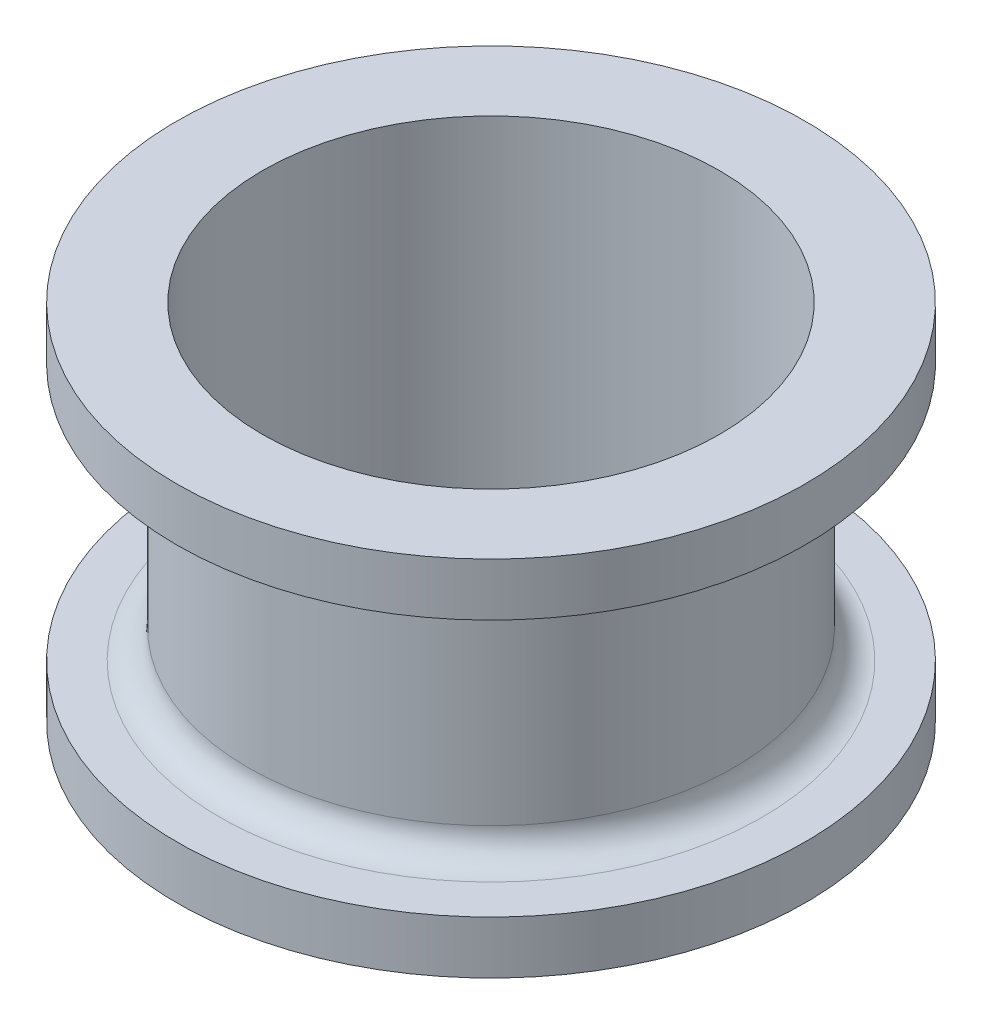
ISO-10303-21;
HEADER;
FILE_DESCRIPTION(('STEP AP214'),'2;1');
FILE_NAME('part.step','',(''),(''),'','','');
FILE_SCHEMA(('AUTOMOTIVE_DESIGN { 1 0 10303 214 1 1 1 1 }'));
ENDSEC;
DATA;
#1=APPLICATION_CONTEXT('core data for automotive mechanical design processes');
#2=APPLICATION_PROTOCOL_DEFINITION('international standard','automotive_design',2000,#1);
#3=PRODUCT_CONTEXT('',#1,'mechanical');
#4=PRODUCT('Part','Part','',(#3));
#5=PRODUCT_RELATED_PRODUCT_CATEGORY('part','',(#4));
#6=PRODUCT_DEFINITION_FORMATION('','',#4);
#7=PRODUCT_DEFINITION_CONTEXT('part definition',#1,'design');
#8=PRODUCT_DEFINITION('design','',#6,#7);
#9=PRODUCT_DEFINITION_SHAPE('','',#8);
#10=(LENGTH_UNIT() NAMED_UNIT(*) SI_UNIT(.MILLI.,.METRE.));
#11=(NAMED_UNIT(*) PLANE_ANGLE_UNIT() SI_UNIT($,.RADIAN.));
#12=(NAMED_UNIT(*) SI_UNIT($,.STERADIAN.) SOLID_ANGLE_UNIT());
#13=UNCERTAINTY_MEASURE_WITH_UNIT(LENGTH_MEASURE(1.E-05),#10,'distance_accuracy_value','');
#14=(GEOMETRIC_REPRESENTATION_CONTEXT(3) GLOBAL_UNCERTAINTY_ASSIGNED_CONTEXT((#13)) GLOBAL_UNIT_ASSIGNED_CONTEXT((#10,
#11,#12)) REPRESENTATION_CONTEXT('',''));
#15=CARTESIAN_POINT('',(0.,0.,0.));
#16=DIRECTION('',(0.,0.,1.));
#17=DIRECTION('',(1.,0.,0.));
#18=AXIS2_PLACEMENT_3D('',#15,#16,#17);
#19=CARTESIAN_POINT('',(0.,9.,0.));
#20=DIRECTION('',(0.,-1.,0.));
#21=DIRECTION('',(0.,0.,-1.));
#22=AXIS2_PLACEMENT_3D('',#19,#20,#21);
#23=CYLINDRICAL_SURFACE('',#22,8.5);
#24=CARTESIAN_POINT('',(0.,0.999999999999999,0.));
#25=DIRECTION('',(0.,-1.,0.));
#26=DIRECTION('',(0.,0.,-1.));
#27=AXIS2_PLACEMENT_3D('',#24,#25,#26);
#28=CIRCLE('',#27,8.5);
#29=CARTESIAN_POINT('',(0.,0.999999999999999,-8.5));
#30=VERTEX_POINT('',#29);
#31=EDGE_CURVE('E53',#30,#30,#28,.F.);
#32=ORIENTED_EDGE('',*,*,#31,.T.);
#33=EDGE_LOOP('',(#32));
#34=FACE_BOUND('',#33,.T.);
#35=CARTESIAN_POINT('',(0.,8.,0.));
#36=DIRECTION('',(0.,1.,0.));
#37=DIRECTION('',(0.,0.,1.));
#38=AXIS2_PLACEMENT_3D('',#35,#36,#37);
#39=CIRCLE('',#38,8.5);
#40=CARTESIAN_POINT('',(0.,8.,8.5));
#41=VERTEX_POINT('',#40);
#42=EDGE_CURVE('E58',#41,#41,#39,.F.);
#43=ORIENTED_EDGE('',*,*,#42,.T.);
#44=EDGE_LOOP('',(#43));
#45=FACE_BOUND('',#44,.T.);
#46=ADVANCED_FACE('F40',(#34,#45),#23,.T.);
#47=CARTESIAN_POINT('',(0.,10.85,0.));
#48=DIRECTION('',(0.,-1.,0.));
#49=DIRECTION('',(0.,0.,-1.));
#50=AXIS2_PLACEMENT_3D('',#47,#48,#49);
#51=CYLINDRICAL_SURFACE('',#50,11.);
#52=CARTESIAN_POINT('',(0.,10.85,0.));
#53=DIRECTION('',(0.,1.,0.));
#54=DIRECTION('',(0.,0.,1.));
#55=AXIS2_PLACEMENT_3D('',#52,#53,#54);
#56=CIRCLE('',#55,11.);
#57=CARTESIAN_POINT('',(0.,10.85,11.));
#58=VERTEX_POINT('',#57);
#59=EDGE_CURVE('E64',#58,#58,#56,.T.);
#60=ORIENTED_EDGE('',*,*,#59,.F.);
#61=EDGE_LOOP('',(#60));
#62=FACE_BOUND('',#61,.T.);
#63=CARTESIAN_POINT('',(0.,9.,0.));
#64=DIRECTION('',(0.,1.,0.));
#65=DIRECTION('',(0.,0.,1.));
#66=AXIS2_PLACEMENT_3D('',#63,#64,#65);
#67=CIRCLE('',#66,11.);
#68=CARTESIAN_POINT('',(0.,9.,11.));
#69=VERTEX_POINT('',#68);
#70=EDGE_CURVE('E65',#69,#69,#67,.T.);
#71=ORIENTED_EDGE('',*,*,#70,.T.);
#72=EDGE_LOOP('',(#71));
#73=FACE_BOUND('',#72,.T.);
#74=ADVANCED_FACE('F120',(#62,#73),#51,.T.);
#75=CARTESIAN_POINT('',(0.,10.85,0.));
#76=DIRECTION('',(0.,1.,0.));
#77=DIRECTION('',(0.,0.,1.));
#78=AXIS2_PLACEMENT_3D('',#75,#76,#77);
#79=PLANE('',#78);
#80=CARTESIAN_POINT('',(0.,10.85,0.));
#81=DIRECTION('',(0.,-1.,0.));
#82=DIRECTION('',(0.,0.,-1.));
#83=AXIS2_PLACEMENT_3D('',#80,#81,#82);
#84=CIRCLE('',#83,8.);
#85=CARTESIAN_POINT('',(0.,10.85,-8.));
#86=VERTEX_POINT('',#85);
#87=EDGE_CURVE('E77',#86,#86,#84,.T.);
#88=ORIENTED_EDGE('',*,*,#87,.T.);
#89=EDGE_LOOP('',(#88));
#90=FACE_BOUND('',#89,.T.);
#91=ORIENTED_EDGE('',*,*,#59,.T.);
#92=EDGE_LOOP('',(#91));
#93=FACE_BOUND('',#92,.T.);
#94=ADVANCED_FACE('F89',(#90,#93),#79,.T.);
#95=CARTESIAN_POINT('',(0.,9.,0.));
#96=DIRECTION('',(0.,1.,0.));
#97=DIRECTION('',(0.,0.,1.));
#98=AXIS2_PLACEMENT_3D('',#95,#96,#97);
#99=PLANE('',#98);
#100=CARTESIAN_POINT('',(0.,9.,0.));
#101=DIRECTION('',(0.,1.,0.));
#102=DIRECTION('',(0.,0.,1.));
#103=AXIS2_PLACEMENT_3D('',#100,#101,#102);
#104=CIRCLE('',#103,9.5);
#105=CARTESIAN_POINT('',(0.,9.,9.5));
#106=VERTEX_POINT('',#105);
#107=EDGE_CURVE('E10',#106,#106,#104,.T.);
#108=ORIENTED_EDGE('',*,*,#107,.T.);
#109=EDGE_LOOP('',(#108));
#110=FACE_BOUND('',#109,.T.);
#111=ORIENTED_EDGE('',*,*,#70,.F.);
#112=EDGE_LOOP('',(#111));
#113=FACE_BOUND('',#112,.T.);
#114=ADVANCED_FACE('F109',(#110,#113),#99,.F.);
#115=CARTESIAN_POINT('',(0.,-1.85,0.));
#116=DIRECTION('',(0.,1.,0.));
#117=DIRECTION('',(0.,0.,1.));
#118=AXIS2_PLACEMENT_3D('',#115,#116,#117);
#119=CYLINDRICAL_SURFACE('',#118,11.);
#120=CARTESIAN_POINT('',(0.,-1.85,0.));
#121=DIRECTION('',(0.,-1.,0.));
#122=DIRECTION('',(0.,0.,-1.));
#123=AXIS2_PLACEMENT_3D('',#120,#121,#122);
#124=CIRCLE('',#123,11.);
#125=CARTESIAN_POINT('',(0.,-1.85,-11.));
#126=VERTEX_POINT('',#125);
#127=EDGE_CURVE('E69',#126,#126,#124,.T.);
#128=ORIENTED_EDGE('',*,*,#127,.F.);
#129=EDGE_LOOP('',(#128));
#130=FACE_BOUND('',#129,.T.);
#131=CARTESIAN_POINT('',(0.,0.,0.));
#132=DIRECTION('',(0.,-1.,0.));
#133=DIRECTION('',(0.,0.,-1.));
#134=AXIS2_PLACEMENT_3D('',#131,#132,#133);
#135=CIRCLE('',#134,11.);
#136=CARTESIAN_POINT('',(0.,0.,-11.));
#137=VERTEX_POINT('',#136);
#138=EDGE_CURVE('E73',#137,#137,#135,.T.);
#139=ORIENTED_EDGE('',*,*,#138,.T.);
#140=EDGE_LOOP('',(#139));
#141=FACE_BOUND('',#140,.T.);
#142=ADVANCED_FACE('F103',(#130,#141),#119,.T.);
#143=CARTESIAN_POINT('',(0.,-1.85,0.));
#144=DIRECTION('',(0.,-1.,0.));
#145=DIRECTION('',(0.,0.,-1.));
#146=AXIS2_PLACEMENT_3D('',#143,#144,#145);
#147=PLANE('',#146);
#148=CARTESIAN_POINT('',(0.,-1.85,0.));
#149=DIRECTION('',(0.,-1.,0.));
#150=DIRECTION('',(0.,0.,-1.));
#151=AXIS2_PLACEMENT_3D('',#148,#149,#150);
#152=CIRCLE('',#151,8.);
#153=CARTESIAN_POINT('',(0.,-1.85,-8.));
#154=VERTEX_POINT('',#153);
#155=EDGE_CURVE('E81',#154,#154,#152,.T.);
#156=ORIENTED_EDGE('',*,*,#155,.F.);
#157=EDGE_LOOP('',(#156));
#158=FACE_BOUND('',#157,.T.);
#159=ORIENTED_EDGE('',*,*,#127,.T.);
#160=EDGE_LOOP('',(#159));
#161=FACE_BOUND('',#160,.T.);
#162=ADVANCED_FACE('F100',(#158,#161),#147,.T.);
#163=CARTESIAN_POINT('',(0.,0.,0.));
#164=DIRECTION('',(0.,-1.,0.));
#165=DIRECTION('',(0.,0.,-1.));
#166=AXIS2_PLACEMENT_3D('',#163,#164,#165);
#167=PLANE('',#166);
#168=CARTESIAN_POINT('',(0.,0.,0.));
#169=DIRECTION('',(0.,-1.,0.));
#170=DIRECTION('',(0.,0.,-1.));
#171=AXIS2_PLACEMENT_3D('',#168,#169,#170);
#172=CIRCLE('',#171,9.5);
#173=CARTESIAN_POINT('',(0.,0.,-9.5));
#174=VERTEX_POINT('',#173);
#175=EDGE_CURVE('E48',#174,#174,#172,.T.);
#176=ORIENTED_EDGE('',*,*,#175,.T.);
#177=EDGE_LOOP('',(#176));
#178=FACE_BOUND('',#177,.T.);
#179=ORIENTED_EDGE('',*,*,#138,.F.);
#180=EDGE_LOOP('',(#179));
#181=FACE_BOUND('',#180,.T.);
#182=ADVANCED_FACE('F96',(#178,#181),#167,.F.);
#183=CARTESIAN_POINT('',(0.,10.85,0.));
#184=DIRECTION('',(0.,-1.,0.));
#185=DIRECTION('',(0.,0.,-1.));
#186=AXIS2_PLACEMENT_3D('',#183,#184,#185);
#187=CYLINDRICAL_SURFACE('',#186,8.);
#188=ORIENTED_EDGE('',*,*,#87,.F.);
#189=EDGE_LOOP('',(#188));
#190=FACE_BOUND('',#189,.T.);
#191=ORIENTED_EDGE('',*,*,#155,.T.);
#192=EDGE_LOOP('',(#191));
#193=FACE_BOUND('',#192,.T.);
#194=ADVANCED_FACE('F92',(#190,#193),#187,.F.);
#195=CARTESIAN_POINT('',(0.,0.999999999999999,0.));
#196=DIRECTION('',(0.,-1.,0.));
#197=DIRECTION('',(0.,0.,-1.));
#198=AXIS2_PLACEMENT_3D('',#195,#196,#197);
#199=TOROIDAL_SURFACE('',#198,9.5,1.);
#200=ORIENTED_EDGE('',*,*,#175,.F.);
#201=EDGE_LOOP('',(#200));
#202=FACE_BOUND('',#201,.T.);
#203=ORIENTED_EDGE('',*,*,#31,.F.);
#204=EDGE_LOOP('',(#203));
#205=FACE_BOUND('',#204,.T.);
#206=ADVANCED_FACE('F95',(#202,#205),#199,.F.);
#207=CARTESIAN_POINT('',(0.,8.,0.));
#208=DIRECTION('',(0.,1.,0.));
#209=DIRECTION('',(0.,0.,1.));
#210=AXIS2_PLACEMENT_3D('',#207,#208,#209);
#211=TOROIDAL_SURFACE('',#210,9.5,1.);
#212=ORIENTED_EDGE('',*,*,#42,.F.);
#213=EDGE_LOOP('',(#212));
#214=FACE_BOUND('',#213,.T.);
#215=ORIENTED_EDGE('',*,*,#107,.F.);
#216=EDGE_LOOP('',(#215));
#217=FACE_BOUND('',#216,.T.);
#218=ADVANCED_FACE('F42',(#214,#217),#211,.F.);
#219=CLOSED_SHELL('',(#46,#74,#94,#114,#142,#162,#182,#194,#206,#218));
#220=MANIFOLD_SOLID_BREP('B2',#219);
#221=ADVANCED_BREP_SHAPE_REPRESENTATION('',(#18,#220),#14);
#222=SHAPE_DEFINITION_REPRESENTATION(#9,#221);
ENDSEC;
END-ISO-10303-21;
